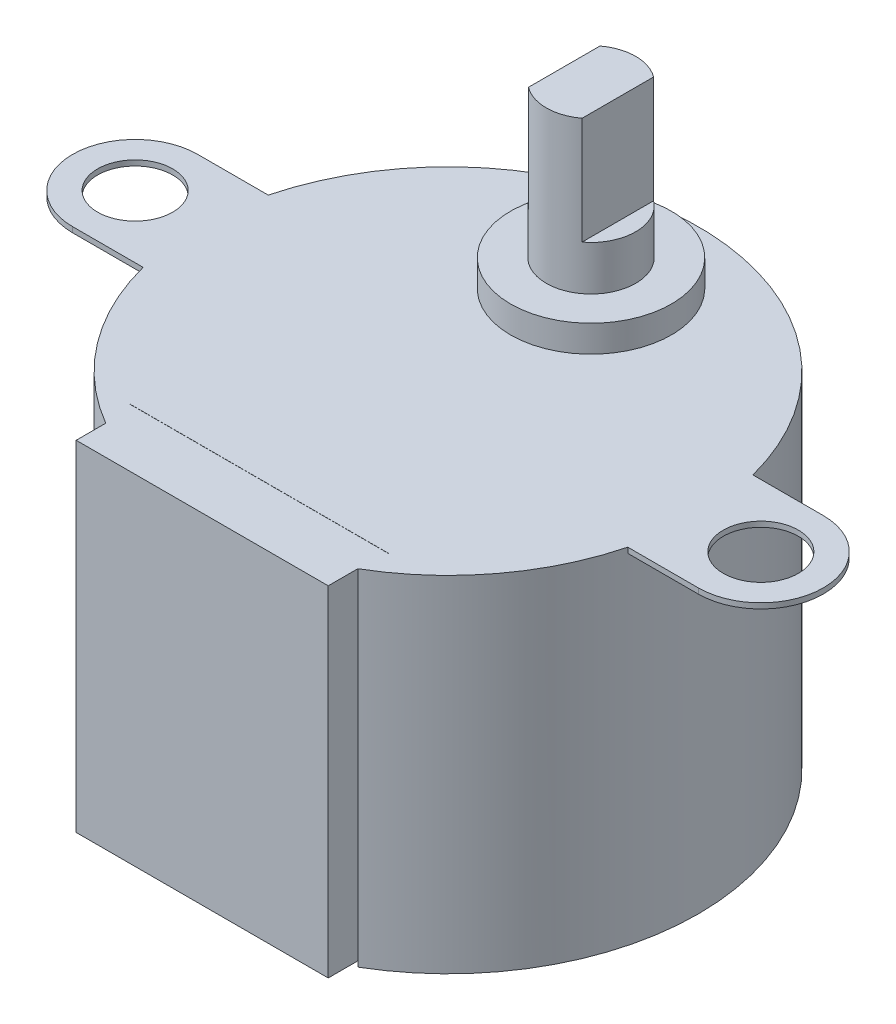
ISO-10303-21;
HEADER;
FILE_DESCRIPTION(('STEP AP214'),'2;1');
FILE_NAME('part.step','',(''),(''),'','','');
FILE_SCHEMA(('AUTOMOTIVE_DESIGN { 1 0 10303 214 1 1 1 1 }'));
ENDSEC;
DATA;
#1=APPLICATION_CONTEXT('core data for automotive mechanical design processes');
#2=APPLICATION_PROTOCOL_DEFINITION('international standard','automotive_design',2000,#1);
#3=PRODUCT_CONTEXT('',#1,'mechanical');
#4=PRODUCT('Part','Part','',(#3));
#5=PRODUCT_RELATED_PRODUCT_CATEGORY('part','',(#4));
#6=PRODUCT_DEFINITION_FORMATION('','',#4);
#7=PRODUCT_DEFINITION_CONTEXT('part definition',#1,'design');
#8=PRODUCT_DEFINITION('design','',#6,#7);
#9=PRODUCT_DEFINITION_SHAPE('','',#8);
#10=(LENGTH_UNIT() NAMED_UNIT(*) SI_UNIT(.MILLI.,.METRE.));
#11=(NAMED_UNIT(*) PLANE_ANGLE_UNIT() SI_UNIT($,.RADIAN.));
#12=(NAMED_UNIT(*) SI_UNIT($,.STERADIAN.) SOLID_ANGLE_UNIT());
#13=UNCERTAINTY_MEASURE_WITH_UNIT(LENGTH_MEASURE(1.E-05),#10,'distance_accuracy_value','');
#14=(GEOMETRIC_REPRESENTATION_CONTEXT(3) GLOBAL_UNCERTAINTY_ASSIGNED_CONTEXT((#13)) GLOBAL_UNIT_ASSIGNED_CONTEXT((#10,
#11,#12)) REPRESENTATION_CONTEXT('',''));
#15=CARTESIAN_POINT('',(0.,0.,0.));
#16=DIRECTION('',(0.,0.,1.));
#17=DIRECTION('',(1.,0.,0.));
#18=AXIS2_PLACEMENT_3D('',#15,#16,#17);
#19=CARTESIAN_POINT('',(0.,20.5,-8.));
#20=DIRECTION('',(0.,-1.,0.));
#21=DIRECTION('',(0.,0.,-1.));
#22=AXIS2_PLACEMENT_3D('',#19,#20,#21);
#23=CYLINDRICAL_SURFACE('',#22,4.5);
#24=CARTESIAN_POINT('',(0.,20.5,-8.));
#25=DIRECTION('',(0.,1.,0.));
#26=DIRECTION('',(0.,0.,1.));
#27=AXIS2_PLACEMENT_3D('',#24,#25,#26);
#28=CIRCLE('',#27,4.5);
#29=CARTESIAN_POINT('',(0.,20.5,-3.5));
#30=VERTEX_POINT('',#29);
#31=EDGE_CURVE('E13',#30,#30,#28,.T.);
#32=ORIENTED_EDGE('',*,*,#31,.F.);
#33=EDGE_LOOP('',(#32));
#34=FACE_BOUND('',#33,.T.);
#35=CARTESIAN_POINT('',(0.,19.,-8.));
#36=DIRECTION('',(0.,1.,0.));
#37=DIRECTION('',(0.,0.,1.));
#38=AXIS2_PLACEMENT_3D('',#35,#36,#37);
#39=CIRCLE('',#38,4.5);
#40=CARTESIAN_POINT('',(0.,19.,-3.5));
#41=VERTEX_POINT('',#40);
#42=EDGE_CURVE('E75',#41,#41,#39,.T.);
#43=ORIENTED_EDGE('',*,*,#42,.T.);
#44=EDGE_LOOP('',(#43));
#45=FACE_BOUND('',#44,.T.);
#46=ADVANCED_FACE('F72',(#34,#45),#23,.T.);
#47=CARTESIAN_POINT('',(0.,20.5,-8.));
#48=DIRECTION('',(0.,1.,0.));
#49=DIRECTION('',(0.,0.,1.));
#50=AXIS2_PLACEMENT_3D('',#47,#48,#49);
#51=PLANE('',#50);
#52=CARTESIAN_POINT('',(0.,20.5,-8.));
#53=DIRECTION('',(0.,1.,0.));
#54=DIRECTION('',(0.,0.,1.));
#55=AXIS2_PLACEMENT_3D('',#52,#53,#54);
#56=CIRCLE('',#55,2.5);
#57=CARTESIAN_POINT('',(0.,20.5,-5.5));
#58=VERTEX_POINT('',#57);
#59=EDGE_CURVE('E143',#58,#58,#56,.T.);
#60=ORIENTED_EDGE('',*,*,#59,.F.);
#61=EDGE_LOOP('',(#60));
#62=FACE_BOUND('',#61,.T.);
#63=ORIENTED_EDGE('',*,*,#31,.T.);
#64=EDGE_LOOP('',(#63));
#65=FACE_BOUND('',#64,.T.);
#66=ADVANCED_FACE('F166',(#62,#65),#51,.T.);
#67=CARTESIAN_POINT('',(0.,19.,-8.));
#68=DIRECTION('',(0.,1.,0.));
#69=DIRECTION('',(0.,0.,1.));
#70=AXIS2_PLACEMENT_3D('',#67,#68,#69);
#71=PLANE('',#70);
#72=ORIENTED_EDGE('',*,*,#42,.F.);
#73=EDGE_LOOP('',(#72));
#74=FACE_BOUND('',#73,.T.);
#75=ADVANCED_FACE('F171',(#74),#71,.F.);
#76=CARTESIAN_POINT('',(0.,29.,-8.));
#77=DIRECTION('',(0.,-1.,0.));
#78=DIRECTION('',(0.,0.,-1.));
#79=AXIS2_PLACEMENT_3D('',#76,#77,#78);
#80=CYLINDRICAL_SURFACE('',#79,2.5);
#81=CARTESIAN_POINT('',(0.,29.,-8.));
#82=DIRECTION('',(0.,1.,0.));
#83=DIRECTION('',(0.,0.,1.));
#84=AXIS2_PLACEMENT_3D('',#81,#82,#83);
#85=CIRCLE('',#84,2.5);
#86=CARTESIAN_POINT('',(1.5,29.,-10.));
#87=VERTEX_POINT('',#86);
#88=CARTESIAN_POINT('',(-1.5,29.,-10.));
#89=VERTEX_POINT('',#88);
#90=EDGE_CURVE('E129',#87,#89,#85,.T.);
#91=ORIENTED_EDGE('',*,*,#90,.F.);
#92=DIRECTION('',(0.,1.,0.));
#93=VECTOR('',#92,1.);
#94=CARTESIAN_POINT('',(1.5,23.,-10.));
#95=LINE('',#94,#93);
#96=CARTESIAN_POINT('',(1.5,23.,-10.));
#97=VERTEX_POINT('',#96);
#98=EDGE_CURVE('E86',#97,#87,#95,.T.);
#99=ORIENTED_EDGE('',*,*,#98,.F.);
#100=CARTESIAN_POINT('',(0.,23.,-8.));
#101=DIRECTION('',(0.,1.,0.));
#102=DIRECTION('',(0.,0.,-1.));
#103=AXIS2_PLACEMENT_3D('',#100,#101,#102);
#104=CIRCLE('',#103,2.5);
#105=CARTESIAN_POINT('',(1.5,23.,-6.));
#106=VERTEX_POINT('',#105);
#107=EDGE_CURVE('E115',#106,#97,#104,.T.);
#108=ORIENTED_EDGE('',*,*,#107,.F.);
#109=DIRECTION('',(0.,1.,0.));
#110=VECTOR('',#109,1.);
#111=CARTESIAN_POINT('',(1.5,23.,-6.));
#112=LINE('',#111,#110);
#113=CARTESIAN_POINT('',(1.5,29.,-6.));
#114=VERTEX_POINT('',#113);
#115=EDGE_CURVE('E123',#106,#114,#112,.T.);
#116=ORIENTED_EDGE('',*,*,#115,.T.);
#117=CARTESIAN_POINT('',(-1.5,29.,-6.));
#118=VERTEX_POINT('',#117);
#119=EDGE_CURVE('E145',#118,#114,#85,.T.);
#120=ORIENTED_EDGE('',*,*,#119,.F.);
#121=DIRECTION('',(0.,1.,0.));
#122=VECTOR('',#121,1.);
#123=CARTESIAN_POINT('',(-1.5,23.,-6.));
#124=LINE('',#123,#122);
#125=CARTESIAN_POINT('',(-1.5,23.,-6.));
#126=VERTEX_POINT('',#125);
#127=EDGE_CURVE('E94',#126,#118,#124,.T.);
#128=ORIENTED_EDGE('',*,*,#127,.F.);
#129=CARTESIAN_POINT('',(0.,23.,-8.));
#130=DIRECTION('',(0.,1.,0.));
#131=DIRECTION('',(0.,0.,1.));
#132=AXIS2_PLACEMENT_3D('',#129,#130,#131);
#133=CIRCLE('',#132,2.5);
#134=CARTESIAN_POINT('',(-1.5,23.,-10.));
#135=VERTEX_POINT('',#134);
#136=EDGE_CURVE('E135',#135,#126,#133,.T.);
#137=ORIENTED_EDGE('',*,*,#136,.F.);
#138=DIRECTION('',(0.,1.,0.));
#139=VECTOR('',#138,1.);
#140=CARTESIAN_POINT('',(-1.5,23.,-10.));
#141=LINE('',#140,#139);
#142=EDGE_CURVE('E141',#135,#89,#141,.T.);
#143=ORIENTED_EDGE('',*,*,#142,.T.);
#144=EDGE_LOOP('',(#91,#99,#108,#116,#120,#128,#137,#143));
#145=FACE_BOUND('',#144,.T.);
#146=ORIENTED_EDGE('',*,*,#59,.T.);
#147=EDGE_LOOP('',(#146));
#148=FACE_BOUND('',#147,.T.);
#149=ADVANCED_FACE('F126',(#145,#148),#80,.T.);
#150=CARTESIAN_POINT('',(0.,29.,-8.));
#151=DIRECTION('',(0.,1.,0.));
#152=DIRECTION('',(0.,0.,1.));
#153=AXIS2_PLACEMENT_3D('',#150,#151,#152);
#154=PLANE('',#153);
#155=DIRECTION('',(0.,0.,1.));
#156=VECTOR('',#155,1.);
#157=CARTESIAN_POINT('',(1.5,29.,-10.));
#158=LINE('',#157,#156);
#159=EDGE_CURVE('E120',#87,#114,#158,.T.);
#160=ORIENTED_EDGE('',*,*,#159,.F.);
#161=ORIENTED_EDGE('',*,*,#90,.T.);
#162=DIRECTION('',(0.,0.,-1.));
#163=VECTOR('',#162,1.);
#164=CARTESIAN_POINT('',(-1.5,29.,-10.));
#165=LINE('',#164,#163);
#166=EDGE_CURVE('E131',#118,#89,#165,.T.);
#167=ORIENTED_EDGE('',*,*,#166,.F.);
#168=ORIENTED_EDGE('',*,*,#119,.T.);
#169=EDGE_LOOP('',(#160,#161,#167,#168));
#170=FACE_BOUND('',#169,.T.);
#171=ADVANCED_FACE('F151',(#170),#154,.T.);
#172=CARTESIAN_POINT('',(-1.5,23.,-10.));
#173=DIRECTION('',(1.,0.,0.));
#174=DIRECTION('',(0.,0.,-1.));
#175=AXIS2_PLACEMENT_3D('',#172,#173,#174);
#176=PLANE('',#175);
#177=ORIENTED_EDGE('',*,*,#166,.T.);
#178=ORIENTED_EDGE('',*,*,#142,.F.);
#179=DIRECTION('',(0.,0.,-1.));
#180=VECTOR('',#179,1.);
#181=CARTESIAN_POINT('',(-1.5,23.,-10.));
#182=LINE('',#181,#180);
#183=EDGE_CURVE('E137',#126,#135,#182,.T.);
#184=ORIENTED_EDGE('',*,*,#183,.F.);
#185=ORIENTED_EDGE('',*,*,#127,.T.);
#186=EDGE_LOOP('',(#177,#178,#184,#185));
#187=FACE_BOUND('',#186,.T.);
#188=ADVANCED_FACE('F153',(#187),#176,.F.);
#189=CARTESIAN_POINT('',(0.,23.,-8.));
#190=DIRECTION('',(0.,1.,0.));
#191=DIRECTION('',(0.,0.,1.));
#192=AXIS2_PLACEMENT_3D('',#189,#190,#191);
#193=PLANE('',#192);
#194=ORIENTED_EDGE('',*,*,#136,.T.);
#195=ORIENTED_EDGE('',*,*,#183,.T.);
#196=EDGE_LOOP('',(#194,#195));
#197=FACE_BOUND('',#196,.T.);
#198=ADVANCED_FACE('F156',(#197),#193,.T.);
#199=CARTESIAN_POINT('',(1.5,23.,-10.));
#200=DIRECTION('',(-1.,0.,0.));
#201=DIRECTION('',(0.,0.,1.));
#202=AXIS2_PLACEMENT_3D('',#199,#200,#201);
#203=PLANE('',#202);
#204=ORIENTED_EDGE('',*,*,#159,.T.);
#205=ORIENTED_EDGE('',*,*,#115,.F.);
#206=DIRECTION('',(0.,0.,1.));
#207=VECTOR('',#206,1.);
#208=CARTESIAN_POINT('',(1.5,23.,-10.));
#209=LINE('',#208,#207);
#210=EDGE_CURVE('E117',#97,#106,#209,.T.);
#211=ORIENTED_EDGE('',*,*,#210,.F.);
#212=ORIENTED_EDGE('',*,*,#98,.T.);
#213=EDGE_LOOP('',(#204,#205,#211,#212));
#214=FACE_BOUND('',#213,.T.);
#215=ADVANCED_FACE('F122',(#214),#203,.F.);
#216=CARTESIAN_POINT('',(0.,23.,-8.));
#217=DIRECTION('',(0.,-1.,0.));
#218=DIRECTION('',(0.,0.,-1.));
#219=AXIS2_PLACEMENT_3D('',#216,#217,#218);
#220=PLANE('',#219);
#221=ORIENTED_EDGE('',*,*,#107,.T.);
#222=ORIENTED_EDGE('',*,*,#210,.T.);
#223=EDGE_LOOP('',(#221,#222));
#224=FACE_BOUND('',#223,.T.);
#225=ADVANCED_FACE('F116',(#224),#220,.F.);
#226=CLOSED_SHELL('',(#46,#66,#75,#149,#171,#188,#198,#215,#225));
#227=MANIFOLD_SOLID_BREP('B2',#226);
#228=CARTESIAN_POINT('',(0.,0.,0.));
#229=DIRECTION('',(0.,1.,0.));
#230=DIRECTION('',(0.,0.,1.));
#231=AXIS2_PLACEMENT_3D('',#228,#229,#230);
#232=PLANE('',#231);
#233=DIRECTION('',(0.,0.,-1.));
#234=VECTOR('',#233,1.);
#235=CARTESIAN_POINT('',(7.06267964530488,0.,10.7438975791592));
#236=LINE('',#235,#234);
#237=CARTESIAN_POINT('',(7.06267964530488,0.,12.0879508696799));
#238=VERTEX_POINT('',#237);
#239=CARTESIAN_POINT('',(7.05633982265244,0.,10.7469487895796));
#240=VERTEX_POINT('',#239);
#241=EDGE_CURVE('E263',#238,#240,#236,.T.);
#242=ORIENTED_EDGE('',*,*,#241,.F.);
#243=CARTESIAN_POINT('',(0.,0.,0.));
#244=DIRECTION('',(0.,1.,0.));
#245=DIRECTION('',(0.,0.,1.));
#246=AXIS2_PLACEMENT_3D('',#243,#244,#245);
#247=CIRCLE('',#246,14.);
#248=CARTESIAN_POINT('',(7.05,0.,12.0953503463108));
#249=VERTEX_POINT('',#248);
#250=EDGE_CURVE('E596',#249,#238,#247,.T.);
#251=ORIENTED_EDGE('',*,*,#250,.F.);
#252=DIRECTION('',(0.,0.,-1.));
#253=VECTOR('',#252,1.);
#254=CARTESIAN_POINT('',(7.05,0.,13.75));
#255=LINE('',#254,#253);
#256=CARTESIAN_POINT('',(7.05,0.,13.75));
#257=VERTEX_POINT('',#256);
#258=EDGE_CURVE('E431',#257,#249,#255,.T.);
#259=ORIENTED_EDGE('',*,*,#258,.F.);
#260=DIRECTION('',(1.,0.,0.));
#261=VECTOR('',#260,1.);
#262=CARTESIAN_POINT('',(-7.05,0.,13.75));
#263=LINE('',#262,#261);
#264=CARTESIAN_POINT('',(-7.05,0.,13.75));
#265=VERTEX_POINT('',#264);
#266=EDGE_CURVE('E417',#265,#257,#263,.T.);
#267=ORIENTED_EDGE('',*,*,#266,.F.);
#268=DIRECTION('',(0.,0.,-1.));
#269=VECTOR('',#268,1.);
#270=CARTESIAN_POINT('',(-7.05,0.,13.75));
#271=LINE('',#270,#269);
#272=CARTESIAN_POINT('',(-7.04987773098629,0.,12.0954849220939));
#273=VERTEX_POINT('',#272);
#274=EDGE_CURVE('E434',#265,#273,#271,.T.);
#275=ORIENTED_EDGE('',*,*,#274,.T.);
#276=DIRECTION('',(0.,0.,-1.));
#277=VECTOR('',#276,1.);
#278=CARTESIAN_POINT('',(-7.04932093730459,0.,0.));
#279=LINE('',#278,#277);
#280=CARTESIAN_POINT('',(-7.04932093730459,0.,10.7438975791592));
#281=VERTEX_POINT('',#280);
#282=EDGE_CURVE('E598',#273,#281,#279,.T.);
#283=ORIENTED_EDGE('',*,*,#282,.T.);
#284=DIRECTION('',(1.,0.,0.));
#285=VECTOR('',#284,1.);
#286=CARTESIAN_POINT('',(0.,0.,10.7438975791592));
#287=LINE('',#286,#285);
#288=EDGE_CURVE('E580',#281,#240,#287,.T.);
#289=ORIENTED_EDGE('',*,*,#288,.T.);
#290=EDGE_LOOP('',(#242,#251,#259,#267,#275,#283,#289));
#291=FACE_BOUND('',#290,.T.);
#292=ADVANCED_FACE('F245',(#291),#232,.F.);
#293=CARTESIAN_POINT('',(7.30000000000001,19.,11.3560556532627));
#294=DIRECTION('',(-1.,0.,0.));
#295=DIRECTION('',(0.,0.,1.));
#296=AXIS2_PLACEMENT_3D('',#293,#294,#295);
#297=PLANE('',#296);
#298=DIRECTION('',(0.,0.,-1.));
#299=VECTOR('',#298,1.);
#300=CARTESIAN_POINT('',(7.30000000000001,18.7,11.3560556532627));
#301=LINE('',#300,#299);
#302=CARTESIAN_POINT('',(7.30000000000001,18.7,11.3560556532627));
#303=VERTEX_POINT('',#302);
#304=CARTESIAN_POINT('',(7.30000000000001,18.7,10.5));
#305=VERTEX_POINT('',#304);
#306=EDGE_CURVE('E545',#303,#305,#301,.T.);
#307=ORIENTED_EDGE('',*,*,#306,.F.);
#308=DIRECTION('',(0.,-1.,0.));
#309=VECTOR('',#308,1.);
#310=CARTESIAN_POINT('',(7.30000000000001,19.,11.3560556532627));
#311=LINE('',#310,#309);
#312=CARTESIAN_POINT('',(7.30000000000001,0.,11.3560556532627));
#313=VERTEX_POINT('',#312);
#314=EDGE_CURVE('E578',#303,#313,#311,.T.);
#315=ORIENTED_EDGE('',*,*,#314,.T.);
#316=DIRECTION('',(0.,0.,-1.));
#317=VECTOR('',#316,1.);
#318=CARTESIAN_POINT('',(7.30000000000001,0.,11.3560556532627));
#319=LINE('',#318,#317);
#320=CARTESIAN_POINT('',(7.30000000000001,0.,10.5));
#321=VERTEX_POINT('',#320);
#322=EDGE_CURVE('E563',#313,#321,#319,.T.);
#323=ORIENTED_EDGE('',*,*,#322,.T.);
#324=DIRECTION('',(0.,-1.,0.));
#325=VECTOR('',#324,1.);
#326=CARTESIAN_POINT('',(7.30000000000001,19.,10.5));
#327=LINE('',#326,#325);
#328=EDGE_CURVE('E566',#305,#321,#327,.T.);
#329=ORIENTED_EDGE('',*,*,#328,.F.);
#330=EDGE_LOOP('',(#307,#315,#323,#329));
#331=FACE_BOUND('',#330,.T.);
#332=ADVANCED_FACE('F665',(#331),#297,.F.);
#333=CARTESIAN_POINT('',(0.,19.,0.));
#334=DIRECTION('',(0.,-1.,0.));
#335=DIRECTION('',(0.,0.,-1.));
#336=AXIS2_PLACEMENT_3D('',#333,#334,#335);
#337=CYLINDRICAL_SURFACE('',#336,13.5);
#338=ORIENTED_EDGE('',*,*,#314,.F.);
#339=CARTESIAN_POINT('',(0.,18.7,0.));
#340=DIRECTION('',(0.,1.,0.));
#341=DIRECTION('',(0.,0.,1.));
#342=AXIS2_PLACEMENT_3D('',#339,#340,#341);
#343=CIRCLE('',#342,13.5);
#344=CARTESIAN_POINT('',(-7.29999999999999,18.7,11.3560556532627));
#345=VERTEX_POINT('',#344);
#346=EDGE_CURVE('E593',#303,#345,#343,.T.);
#347=ORIENTED_EDGE('',*,*,#346,.T.);
#348=DIRECTION('',(0.,-1.,0.));
#349=VECTOR('',#348,1.);
#350=CARTESIAN_POINT('',(-7.29999999999999,19.,11.3560556532627));
#351=LINE('',#350,#349);
#352=CARTESIAN_POINT('',(-7.29999999999999,0.,11.3560556532627));
#353=VERTEX_POINT('',#352);
#354=EDGE_CURVE('E581',#345,#353,#351,.T.);
#355=ORIENTED_EDGE('',*,*,#354,.T.);
#356=CARTESIAN_POINT('',(0.,0.,0.));
#357=DIRECTION('',(0.,1.,0.));
#358=DIRECTION('',(0.,0.,1.));
#359=AXIS2_PLACEMENT_3D('',#356,#357,#358);
#360=CIRCLE('',#359,13.5);
#361=EDGE_CURVE('E567',#313,#353,#360,.T.);
#362=ORIENTED_EDGE('',*,*,#361,.F.);
#363=EDGE_LOOP('',(#338,#347,#355,#362));
#364=FACE_BOUND('',#363,.T.);
#365=ADVANCED_FACE('F669',(#364),#337,.F.);
#366=CARTESIAN_POINT('',(-7.29999999999999,19.,11.3560556532627));
#367=DIRECTION('',(-1.,0.,0.));
#368=DIRECTION('',(0.,0.,1.));
#369=AXIS2_PLACEMENT_3D('',#366,#367,#368);
#370=PLANE('',#369);
#371=ORIENTED_EDGE('',*,*,#354,.F.);
#372=DIRECTION('',(0.,0.,-1.));
#373=VECTOR('',#372,1.);
#374=CARTESIAN_POINT('',(-7.29999999999999,18.7,11.3560556532627));
#375=LINE('',#374,#373);
#376=CARTESIAN_POINT('',(-7.29999999999999,18.7,10.5));
#377=VERTEX_POINT('',#376);
#378=EDGE_CURVE('E549',#345,#377,#375,.T.);
#379=ORIENTED_EDGE('',*,*,#378,.T.);
#380=DIRECTION('',(0.,-1.,0.));
#381=VECTOR('',#380,1.);
#382=CARTESIAN_POINT('',(-7.29999999999999,19.,10.5));
#383=LINE('',#382,#381);
#384=CARTESIAN_POINT('',(-7.29999999999999,0.,10.5));
#385=VERTEX_POINT('',#384);
#386=EDGE_CURVE('E583',#377,#385,#383,.T.);
#387=ORIENTED_EDGE('',*,*,#386,.T.);
#388=DIRECTION('',(0.,0.,-1.));
#389=VECTOR('',#388,1.);
#390=CARTESIAN_POINT('',(-7.29999999999999,0.,11.3560556532627));
#391=LINE('',#390,#389);
#392=EDGE_CURVE('E573',#353,#385,#391,.T.);
#393=ORIENTED_EDGE('',*,*,#392,.F.);
#394=EDGE_LOOP('',(#371,#379,#387,#393));
#395=FACE_BOUND('',#394,.T.);
#396=ADVANCED_FACE('F676',(#395),#370,.T.);
#397=CARTESIAN_POINT('',(-7.29999999999999,19.,10.5));
#398=DIRECTION('',(0.,0.,-1.));
#399=DIRECTION('',(-1.,0.,0.));
#400=AXIS2_PLACEMENT_3D('',#397,#398,#399);
#401=PLANE('',#400);
#402=ORIENTED_EDGE('',*,*,#386,.F.);
#403=DIRECTION('',(1.,0.,0.));
#404=VECTOR('',#403,1.);
#405=CARTESIAN_POINT('',(-7.29999999999999,18.7,10.5));
#406=LINE('',#405,#404);
#407=CARTESIAN_POINT('',(-7.28718717807519,18.7,10.5));
#408=VERTEX_POINT('',#407);
#409=EDGE_CURVE('E546',#377,#408,#406,.T.);
#410=ORIENTED_EDGE('',*,*,#409,.T.);
#411=DIRECTION('',(0.,1.,0.));
#412=VECTOR('',#411,1.);
#413=CARTESIAN_POINT('',(-7.28718717807519,19.,10.5));
#414=LINE('',#413,#412);
#415=CARTESIAN_POINT('',(-7.28718717807519,19.,10.5));
#416=VERTEX_POINT('',#415);
#417=EDGE_CURVE('E70',#408,#416,#414,.T.);
#418=ORIENTED_EDGE('',*,*,#417,.T.);
#419=DIRECTION('',(1.,0.,0.));
#420=VECTOR('',#419,1.);
#421=CARTESIAN_POINT('',(-7.29999999999999,19.,10.5));
#422=LINE('',#421,#420);
#423=CARTESIAN_POINT('',(7.27935857118831,19.,10.5));
#424=VERTEX_POINT('',#423);
#425=EDGE_CURVE('E564',#416,#424,#422,.T.);
#426=ORIENTED_EDGE('',*,*,#425,.T.);
#427=DIRECTION('',(0.,-1.,0.));
#428=VECTOR('',#427,1.);
#429=CARTESIAN_POINT('',(7.27935857118831,19.,10.5));
#430=LINE('',#429,#428);
#431=CARTESIAN_POINT('',(7.27935857118831,18.7,10.5));
#432=VERTEX_POINT('',#431);
#433=EDGE_CURVE('E255',#424,#432,#430,.T.);
#434=ORIENTED_EDGE('',*,*,#433,.T.);
#435=EDGE_CURVE('E543',#432,#305,#406,.T.);
#436=ORIENTED_EDGE('',*,*,#435,.T.);
#437=ORIENTED_EDGE('',*,*,#328,.T.);
#438=DIRECTION('',(1.,0.,0.));
#439=VECTOR('',#438,1.);
#440=CARTESIAN_POINT('',(-7.29999999999999,0.,10.5));
#441=LINE('',#440,#439);
#442=EDGE_CURVE('E570',#385,#321,#441,.T.);
#443=ORIENTED_EDGE('',*,*,#442,.F.);
#444=EDGE_LOOP('',(#402,#410,#418,#426,#434,#436,#437,#443));
#445=FACE_BOUND('',#444,.T.);
#446=ADVANCED_FACE('F673',(#445),#401,.T.);
#447=CARTESIAN_POINT('',(0.,19.,0.));
#448=DIRECTION('',(0.,-1.,0.));
#449=DIRECTION('',(0.,0.,-1.));
#450=AXIS2_PLACEMENT_3D('',#447,#448,#449);
#451=CYLINDRICAL_SURFACE('',#450,14.);
#452=CARTESIAN_POINT('',(0.,18.7,0.));
#453=DIRECTION('',(0.,1.,0.));
#454=DIRECTION('',(0.,0.,1.));
#455=AXIS2_PLACEMENT_3D('',#452,#453,#454);
#456=CIRCLE('',#455,14.);
#457=CARTESIAN_POINT('',(13.555441711726,18.7,3.5));
#458=VERTEX_POINT('',#457);
#459=CARTESIAN_POINT('',(13.555441711726,18.7,-3.5));
#460=VERTEX_POINT('',#459);
#461=EDGE_CURVE('E554',#458,#460,#456,.T.);
#462=ORIENTED_EDGE('',*,*,#461,.F.);
#463=DIRECTION('',(0.,-1.,0.));
#464=VECTOR('',#463,1.);
#465=CARTESIAN_POINT('',(13.555441711726,19.,3.5));
#466=LINE('',#465,#464);
#467=CARTESIAN_POINT('',(13.555441711726,19.,3.5));
#468=VERTEX_POINT('',#467);
#469=EDGE_CURVE('E559',#458,#468,#466,.F.);
#470=ORIENTED_EDGE('',*,*,#469,.T.);
#471=CARTESIAN_POINT('',(0.,19.,0.));
#472=DIRECTION('',(0.,1.,0.));
#473=DIRECTION('',(0.,0.,1.));
#474=AXIS2_PLACEMENT_3D('',#471,#472,#473);
#475=CIRCLE('',#474,14.);
#476=CARTESIAN_POINT('',(7.05,19.,12.0953503463108));
#477=VERTEX_POINT('',#476);
#478=EDGE_CURVE('E587',#477,#468,#475,.T.);
#479=ORIENTED_EDGE('',*,*,#478,.F.);
#480=DIRECTION('',(0.,-1.,0.));
#481=VECTOR('',#480,1.);
#482=CARTESIAN_POINT('',(7.05,19.,12.0953503463108));
#483=LINE('',#482,#481);
#484=EDGE_CURVE('E425',#477,#249,#483,.T.);
#485=ORIENTED_EDGE('',*,*,#484,.T.);
#486=ORIENTED_EDGE('',*,*,#250,.T.);
#487=DIRECTION('',(0.,1.,0.));
#488=VECTOR('',#487,1.);
#489=CARTESIAN_POINT('',(7.06267964530488,-0.3,12.0879508696799));
#490=LINE('',#489,#488);
#491=CARTESIAN_POINT('',(7.06267964530488,-0.3,12.0879508696799));
#492=VERTEX_POINT('',#491);
#493=EDGE_CURVE('E454',#492,#238,#490,.T.);
#494=ORIENTED_EDGE('',*,*,#493,.F.);
#495=CARTESIAN_POINT('',(0.,-0.3,0.));
#496=DIRECTION('',(0.,-1.,0.));
#497=DIRECTION('',(0.,0.,-1.));
#498=AXIS2_PLACEMENT_3D('',#495,#496,#497);
#499=CIRCLE('',#498,14.);
#500=CARTESIAN_POINT('',(-7.04932093730459,-0.3,12.0957461251003));
#501=VERTEX_POINT('',#500);
#502=EDGE_CURVE('E441',#501,#492,#499,.T.);
#503=ORIENTED_EDGE('',*,*,#502,.F.);
#504=DIRECTION('',(0.,1.,0.));
#505=VECTOR('',#504,1.);
#506=CARTESIAN_POINT('',(-7.04932093730459,-0.3,12.0957461251003));
#507=LINE('',#506,#505);
#508=EDGE_CURVE('E459',#501,#273,#507,.T.);
#509=ORIENTED_EDGE('',*,*,#508,.T.);
#510=DIRECTION('',(0.,-1.,0.));
#511=VECTOR('',#510,1.);
#512=CARTESIAN_POINT('',(-7.05,19.,12.0953503463108));
#513=LINE('',#512,#511);
#514=CARTESIAN_POINT('',(-7.05,19.,12.0953503463108));
#515=VERTEX_POINT('',#514);
#516=EDGE_CURVE('E589',#515,#273,#513,.T.);
#517=ORIENTED_EDGE('',*,*,#516,.F.);
#518=CARTESIAN_POINT('',(-13.555441711726,19.,3.5));
#519=VERTEX_POINT('',#518);
#520=EDGE_CURVE('E591',#519,#515,#475,.T.);
#521=ORIENTED_EDGE('',*,*,#520,.F.);
#522=DIRECTION('',(0.,-1.,0.));
#523=VECTOR('',#522,1.);
#524=CARTESIAN_POINT('',(-13.555441711726,19.,3.5));
#525=LINE('',#524,#523);
#526=CARTESIAN_POINT('',(-13.555441711726,18.7,3.5));
#527=VERTEX_POINT('',#526);
#528=EDGE_CURVE('E561',#519,#527,#525,.T.);
#529=ORIENTED_EDGE('',*,*,#528,.T.);
#530=CARTESIAN_POINT('',(-13.555441711726,18.7,-3.5));
#531=VERTEX_POINT('',#530);
#532=EDGE_CURVE('E551',#531,#527,#456,.T.);
#533=ORIENTED_EDGE('',*,*,#532,.F.);
#534=DIRECTION('',(0.,-1.,0.));
#535=VECTOR('',#534,1.);
#536=CARTESIAN_POINT('',(-13.555441711726,19.,-3.5));
#537=LINE('',#536,#535);
#538=CARTESIAN_POINT('',(-13.555441711726,19.,-3.5));
#539=VERTEX_POINT('',#538);
#540=EDGE_CURVE('E555',#531,#539,#537,.F.);
#541=ORIENTED_EDGE('',*,*,#540,.T.);
#542=CARTESIAN_POINT('',(13.555441711726,19.,-3.5));
#543=VERTEX_POINT('',#542);
#544=EDGE_CURVE('E590',#543,#539,#475,.T.);
#545=ORIENTED_EDGE('',*,*,#544,.F.);
#546=DIRECTION('',(0.,-1.,0.));
#547=VECTOR('',#546,1.);
#548=CARTESIAN_POINT('',(13.555441711726,19.,-3.5));
#549=LINE('',#548,#547);
#550=EDGE_CURVE('E557',#543,#460,#549,.T.);
#551=ORIENTED_EDGE('',*,*,#550,.T.);
#552=EDGE_LOOP('',(#462,#470,#479,#485,#486,#494,#503,#509,#517,#521,#529,#533,#541,#545,#551));
#553=FACE_BOUND('',#552,.T.);
#554=ADVANCED_FACE('F247',(#553),#451,.T.);
#555=CARTESIAN_POINT('',(0.,19.,0.));
#556=DIRECTION('',(0.,1.,0.));
#557=DIRECTION('',(0.,0.,1.));
#558=AXIS2_PLACEMENT_3D('',#555,#556,#557);
#559=PLANE('',#558);
#560=DIRECTION('',(0.,0.,1.));
#561=VECTOR('',#560,1.);
#562=CARTESIAN_POINT('',(7.27935857118831,19.,11.3692980782486));
#563=LINE('',#562,#561);
#564=CARTESIAN_POINT('',(7.27935857118831,19.,10.4909931159559));
#565=VERTEX_POINT('',#564);
#566=EDGE_CURVE('E500',#565,#424,#563,.T.);
#567=ORIENTED_EDGE('',*,*,#566,.T.);
#568=ORIENTED_EDGE('',*,*,#425,.F.);
#569=DIRECTION('',(0.,0.,-1.));
#570=VECTOR('',#569,1.);
#571=CARTESIAN_POINT('',(-7.28718717807519,19.,11.3642818968775));
#572=LINE('',#571,#570);
#573=CARTESIAN_POINT('',(-7.28718717807519,19.,10.4909931159559));
#574=VERTEX_POINT('',#573);
#575=EDGE_CURVE('E496',#416,#574,#572,.T.);
#576=ORIENTED_EDGE('',*,*,#575,.T.);
#577=DIRECTION('',(1.,0.,0.));
#578=VECTOR('',#577,1.);
#579=CARTESIAN_POINT('',(-7.28718717807519,19.,10.4909931159559));
#580=LINE('',#579,#578);
#581=EDGE_CURVE('E498',#574,#565,#580,.T.);
#582=ORIENTED_EDGE('',*,*,#581,.T.);
#583=EDGE_LOOP('',(#567,#568,#576,#582));
#584=FACE_BOUND('',#583,.T.);
#585=ORIENTED_EDGE('',*,*,#544,.T.);
#586=DIRECTION('',(-1.,0.,0.));
#587=VECTOR('',#586,1.);
#588=CARTESIAN_POINT('',(-13.0384048104053,19.,-3.5));
#589=LINE('',#588,#587);
#590=CARTESIAN_POINT('',(-17.5,19.,-3.49999999999999));
#591=VERTEX_POINT('',#590);
#592=EDGE_CURVE('E489',#539,#591,#589,.T.);
#593=ORIENTED_EDGE('',*,*,#592,.T.);
#594=CARTESIAN_POINT('',(-17.5,19.,0.));
#595=DIRECTION('',(0.,1.,0.));
#596=DIRECTION('',(0.,0.,1.));
#597=AXIS2_PLACEMENT_3D('',#594,#595,#596);
#598=CIRCLE('',#597,3.5);
#599=CARTESIAN_POINT('',(-17.5,19.,3.5));
#600=VERTEX_POINT('',#599);
#601=EDGE_CURVE('E491',#591,#600,#598,.T.);
#602=ORIENTED_EDGE('',*,*,#601,.T.);
#603=DIRECTION('',(1.,0.,0.));
#604=VECTOR('',#603,1.);
#605=CARTESIAN_POINT('',(-13.0384048104053,19.,3.5));
#606=LINE('',#605,#604);
#607=EDGE_CURVE('E493',#600,#519,#606,.T.);
#608=ORIENTED_EDGE('',*,*,#607,.T.);
#609=ORIENTED_EDGE('',*,*,#520,.T.);
#610=DIRECTION('',(0.,0.,-1.));
#611=VECTOR('',#610,1.);
#612=CARTESIAN_POINT('',(-7.05,19.,13.75));
#613=LINE('',#612,#611);
#614=CARTESIAN_POINT('',(-7.05,19.,13.75));
#615=VERTEX_POINT('',#614);
#616=EDGE_CURVE('E410',#615,#515,#613,.T.);
#617=ORIENTED_EDGE('',*,*,#616,.F.);
#618=DIRECTION('',(1.,0.,0.));
#619=VECTOR('',#618,1.);
#620=CARTESIAN_POINT('',(-7.05,19.,13.75));
#621=LINE('',#620,#619);
#622=CARTESIAN_POINT('',(7.05,19.,13.75));
#623=VERTEX_POINT('',#622);
#624=EDGE_CURVE('E401',#615,#623,#621,.T.);
#625=ORIENTED_EDGE('',*,*,#624,.T.);
#626=DIRECTION('',(0.,0.,-1.));
#627=VECTOR('',#626,1.);
#628=CARTESIAN_POINT('',(7.05,19.,13.75));
#629=LINE('',#628,#627);
#630=EDGE_CURVE('E408',#623,#477,#629,.T.);
#631=ORIENTED_EDGE('',*,*,#630,.T.);
#632=ORIENTED_EDGE('',*,*,#478,.T.);
#633=DIRECTION('',(1.,0.,0.));
#634=VECTOR('',#633,1.);
#635=CARTESIAN_POINT('',(17.5,19.,3.49999999999999));
#636=LINE('',#635,#634);
#637=CARTESIAN_POINT('',(17.5,19.,3.49999999999999));
#638=VERTEX_POINT('',#637);
#639=EDGE_CURVE('E503',#468,#638,#636,.T.);
#640=ORIENTED_EDGE('',*,*,#639,.T.);
#641=CARTESIAN_POINT('',(17.5,19.,0.));
#642=DIRECTION('',(0.,1.,0.));
#643=DIRECTION('',(0.,0.,1.));
#644=AXIS2_PLACEMENT_3D('',#641,#642,#643);
#645=CIRCLE('',#644,3.5);
#646=CARTESIAN_POINT('',(17.5,19.,-3.50000000000001));
#647=VERTEX_POINT('',#646);
#648=EDGE_CURVE('E482',#638,#647,#645,.T.);
#649=ORIENTED_EDGE('',*,*,#648,.T.);
#650=DIRECTION('',(-1.,0.,0.));
#651=VECTOR('',#650,1.);
#652=CARTESIAN_POINT('',(17.5,19.,-3.50000000000001));
#653=LINE('',#652,#651);
#654=EDGE_CURVE('E485',#647,#543,#653,.T.);
#655=ORIENTED_EDGE('',*,*,#654,.T.);
#656=EDGE_LOOP('',(#585,#593,#602,#608,#609,#617,#625,#631,#632,#640,#649,#655));
#657=FACE_BOUND('',#656,.T.);
#658=CARTESIAN_POINT('',(0.,19.,-8.));
#659=DIRECTION('',(0.,1.,0.));
#660=DIRECTION('',(0.,0.,1.));
#661=AXIS2_PLACEMENT_3D('',#658,#659,#660);
#662=CIRCLE('',#661,4.5);
#663=CARTESIAN_POINT('',(0.,19.,-3.5));
#664=VERTEX_POINT('',#663);
#665=EDGE_CURVE('E464',#664,#664,#662,.T.);
#666=ORIENTED_EDGE('',*,*,#665,.F.);
#667=EDGE_LOOP('',(#666));
#668=FACE_BOUND('',#667,.T.);
#669=CARTESIAN_POINT('',(-17.5,19.,0.));
#670=DIRECTION('',(0.,1.,0.));
#671=DIRECTION('',(0.,0.,1.));
#672=AXIS2_PLACEMENT_3D('',#669,#670,#671);
#673=CIRCLE('',#672,2.1);
#674=CARTESIAN_POINT('',(-17.5,19.,2.10000000000001));
#675=VERTEX_POINT('',#674);
#676=EDGE_CURVE('E476',#675,#675,#673,.T.);
#677=ORIENTED_EDGE('',*,*,#676,.F.);
#678=EDGE_LOOP('',(#677));
#679=FACE_BOUND('',#678,.T.);
#680=CARTESIAN_POINT('',(17.5,19.,0.));
#681=DIRECTION('',(0.,1.,0.));
#682=DIRECTION('',(0.,0.,1.));
#683=AXIS2_PLACEMENT_3D('',#680,#681,#682);
#684=CIRCLE('',#683,2.1);
#685=CARTESIAN_POINT('',(17.5,19.,2.09999999999999));
#686=VERTEX_POINT('',#685);
#687=EDGE_CURVE('E470',#686,#686,#684,.T.);
#688=ORIENTED_EDGE('',*,*,#687,.F.);
#689=EDGE_LOOP('',(#688));
#690=FACE_BOUND('',#689,.T.);
#691=ADVANCED_FACE('F404',(#584,#657,#668,#679,#690),#559,.T.);
#692=CARTESIAN_POINT('',(-13.0384048104053,19.,-3.5));
#693=DIRECTION('',(0.,0.,1.));
#694=DIRECTION('',(1.,0.,0.));
#695=AXIS2_PLACEMENT_3D('',#692,#693,#694);
#696=PLANE('',#695);
#697=ORIENTED_EDGE('',*,*,#592,.F.);
#698=ORIENTED_EDGE('',*,*,#540,.F.);
#699=DIRECTION('',(-1.,0.,0.));
#700=VECTOR('',#699,1.);
#701=CARTESIAN_POINT('',(-13.0384048104053,18.7,-3.5));
#702=LINE('',#701,#700);
#703=CARTESIAN_POINT('',(-17.5,18.7,-3.49999999999999));
#704=VERTEX_POINT('',#703);
#705=EDGE_CURVE('E511',#531,#704,#702,.T.);
#706=ORIENTED_EDGE('',*,*,#705,.T.);
#707=DIRECTION('',(0.,-1.,0.));
#708=VECTOR('',#707,1.);
#709=CARTESIAN_POINT('',(-17.5,19.,-3.49999999999999));
#710=LINE('',#709,#708);
#711=EDGE_CURVE('E537',#591,#704,#710,.T.);
#712=ORIENTED_EDGE('',*,*,#711,.F.);
#713=EDGE_LOOP('',(#697,#698,#706,#712));
#714=FACE_BOUND('',#713,.T.);
#715=ADVANCED_FACE('F651',(#714),#696,.F.);
#716=CARTESIAN_POINT('',(-13.0384048104053,19.,3.5));
#717=DIRECTION('',(0.,0.,-1.));
#718=DIRECTION('',(-1.,0.,0.));
#719=AXIS2_PLACEMENT_3D('',#716,#717,#718);
#720=PLANE('',#719);
#721=DIRECTION('',(1.,0.,0.));
#722=VECTOR('',#721,1.);
#723=CARTESIAN_POINT('',(-13.0384048104053,18.7,3.5));
#724=LINE('',#723,#722);
#725=CARTESIAN_POINT('',(-17.5,18.7,3.5));
#726=VERTEX_POINT('',#725);
#727=EDGE_CURVE('E515',#726,#527,#724,.T.);
#728=ORIENTED_EDGE('',*,*,#727,.T.);
#729=ORIENTED_EDGE('',*,*,#528,.F.);
#730=ORIENTED_EDGE('',*,*,#607,.F.);
#731=DIRECTION('',(0.,-1.,0.));
#732=VECTOR('',#731,1.);
#733=CARTESIAN_POINT('',(-17.5,19.,3.5));
#734=LINE('',#733,#732);
#735=EDGE_CURVE('E534',#600,#726,#734,.T.);
#736=ORIENTED_EDGE('',*,*,#735,.T.);
#737=EDGE_LOOP('',(#728,#729,#730,#736));
#738=FACE_BOUND('',#737,.T.);
#739=ADVANCED_FACE('F637',(#738),#720,.F.);
#740=CARTESIAN_POINT('',(17.5,18.7,0.));
#741=DIRECTION('',(0.,1.,0.));
#742=DIRECTION('',(0.,0.,1.));
#743=AXIS2_PLACEMENT_3D('',#740,#741,#742);
#744=PLANE('',#743);
#745=CARTESIAN_POINT('',(17.5,18.7,0.));
#746=DIRECTION('',(0.,1.,0.));
#747=DIRECTION('',(0.,0.,1.));
#748=AXIS2_PLACEMENT_3D('',#745,#746,#747);
#749=CIRCLE('',#748,2.1);
#750=CARTESIAN_POINT('',(17.5,18.7,2.09999999999999));
#751=VERTEX_POINT('',#750);
#752=EDGE_CURVE('E467',#751,#751,#749,.T.);
#753=ORIENTED_EDGE('',*,*,#752,.T.);
#754=EDGE_LOOP('',(#753));
#755=FACE_BOUND('',#754,.T.);
#756=DIRECTION('',(1.,0.,0.));
#757=VECTOR('',#756,1.);
#758=CARTESIAN_POINT('',(17.5,18.7,3.49999999999999));
#759=LINE('',#758,#757);
#760=CARTESIAN_POINT('',(17.5,18.7,3.49999999999999));
#761=VERTEX_POINT('',#760);
#762=EDGE_CURVE('E486',#458,#761,#759,.T.);
#763=ORIENTED_EDGE('',*,*,#762,.F.);
#764=ORIENTED_EDGE('',*,*,#461,.T.);
#765=DIRECTION('',(-1.,0.,0.));
#766=VECTOR('',#765,1.);
#767=CARTESIAN_POINT('',(17.5,18.7,-3.50000000000001));
#768=LINE('',#767,#766);
#769=CARTESIAN_POINT('',(17.5,18.7,-3.50000000000001));
#770=VERTEX_POINT('',#769);
#771=EDGE_CURVE('E508',#770,#460,#768,.T.);
#772=ORIENTED_EDGE('',*,*,#771,.F.);
#773=CARTESIAN_POINT('',(17.5,18.7,0.));
#774=DIRECTION('',(0.,1.,0.));
#775=DIRECTION('',(0.,0.,1.));
#776=AXIS2_PLACEMENT_3D('',#773,#774,#775);
#777=CIRCLE('',#776,3.5);
#778=EDGE_CURVE('E479',#761,#770,#777,.T.);
#779=ORIENTED_EDGE('',*,*,#778,.F.);
#780=EDGE_LOOP('',(#763,#764,#772,#779));
#781=FACE_BOUND('',#780,.T.);
#782=ADVANCED_FACE('F658',(#755,#781),#744,.F.);
#783=CARTESIAN_POINT('',(-17.5,18.7,0.));
#784=DIRECTION('',(0.,1.,0.));
#785=DIRECTION('',(0.,0.,1.));
#786=AXIS2_PLACEMENT_3D('',#783,#784,#785);
#787=CIRCLE('',#786,2.1);
#788=CARTESIAN_POINT('',(-17.5,18.7,2.10000000000001));
#789=VERTEX_POINT('',#788);
#790=EDGE_CURVE('E473',#789,#789,#787,.T.);
#791=ORIENTED_EDGE('',*,*,#790,.T.);
#792=EDGE_LOOP('',(#791));
#793=FACE_BOUND('',#792,.T.);
#794=ORIENTED_EDGE('',*,*,#705,.F.);
#795=ORIENTED_EDGE('',*,*,#532,.T.);
#796=ORIENTED_EDGE('',*,*,#727,.F.);
#797=CARTESIAN_POINT('',(-17.5,18.7,0.));
#798=DIRECTION('',(0.,1.,0.));
#799=DIRECTION('',(0.,0.,1.));
#800=AXIS2_PLACEMENT_3D('',#797,#798,#799);
#801=CIRCLE('',#800,3.5);
#802=EDGE_CURVE('E513',#704,#726,#801,.T.);
#803=ORIENTED_EDGE('',*,*,#802,.F.);
#804=EDGE_LOOP('',(#794,#795,#796,#803));
#805=FACE_BOUND('',#804,.T.);
#806=ADVANCED_FACE('F648',(#793,#805),#744,.F.);
#807=ORIENTED_EDGE('',*,*,#346,.F.);
#808=ORIENTED_EDGE('',*,*,#306,.T.);
#809=ORIENTED_EDGE('',*,*,#435,.F.);
#810=DIRECTION('',(0.,0.,1.));
#811=VECTOR('',#810,1.);
#812=CARTESIAN_POINT('',(7.27935857118831,18.7,11.3692980782486));
#813=LINE('',#812,#811);
#814=CARTESIAN_POINT('',(7.27935857118831,18.7,10.4909931159559));
#815=VERTEX_POINT('',#814);
#816=EDGE_CURVE('E522',#815,#432,#813,.T.);
#817=ORIENTED_EDGE('',*,*,#816,.F.);
#818=DIRECTION('',(1.,0.,0.));
#819=VECTOR('',#818,1.);
#820=CARTESIAN_POINT('',(-7.28718717807519,18.7,10.4909931159559));
#821=LINE('',#820,#819);
#822=CARTESIAN_POINT('',(-7.28718717807519,18.7,10.4909931159559));
#823=VERTEX_POINT('',#822);
#824=EDGE_CURVE('E520',#823,#815,#821,.T.);
#825=ORIENTED_EDGE('',*,*,#824,.F.);
#826=DIRECTION('',(0.,0.,-1.));
#827=VECTOR('',#826,1.);
#828=CARTESIAN_POINT('',(-7.28718717807519,18.7,11.3642818968775));
#829=LINE('',#828,#827);
#830=EDGE_CURVE('E518',#408,#823,#829,.T.);
#831=ORIENTED_EDGE('',*,*,#830,.F.);
#832=ORIENTED_EDGE('',*,*,#409,.F.);
#833=ORIENTED_EDGE('',*,*,#378,.F.);
#834=EDGE_LOOP('',(#807,#808,#809,#817,#825,#831,#832,#833));
#835=FACE_BOUND('',#834,.T.);
#836=CARTESIAN_POINT('',(0.,18.7,-8.));
#837=DIRECTION('',(0.,1.,0.));
#838=DIRECTION('',(0.,0.,1.));
#839=AXIS2_PLACEMENT_3D('',#836,#837,#838);
#840=CIRCLE('',#839,4.5);
#841=CARTESIAN_POINT('',(0.,18.7,-3.5));
#842=VERTEX_POINT('',#841);
#843=EDGE_CURVE('E461',#842,#842,#840,.T.);
#844=ORIENTED_EDGE('',*,*,#843,.T.);
#845=EDGE_LOOP('',(#844));
#846=FACE_BOUND('',#845,.T.);
#847=ADVANCED_FACE('F690',(#835,#846),#744,.F.);
#848=CARTESIAN_POINT('',(17.5,19.,-3.50000000000001));
#849=DIRECTION('',(0.,0.,1.));
#850=DIRECTION('',(1.,0.,0.));
#851=AXIS2_PLACEMENT_3D('',#848,#849,#850);
#852=PLANE('',#851);
#853=ORIENTED_EDGE('',*,*,#771,.T.);
#854=ORIENTED_EDGE('',*,*,#550,.F.);
#855=ORIENTED_EDGE('',*,*,#654,.F.);
#856=DIRECTION('',(0.,-1.,0.));
#857=VECTOR('',#856,1.);
#858=CARTESIAN_POINT('',(17.5,19.,-3.50000000000001));
#859=LINE('',#858,#857);
#860=EDGE_CURVE('E540',#647,#770,#859,.T.);
#861=ORIENTED_EDGE('',*,*,#860,.T.);
#862=EDGE_LOOP('',(#853,#854,#855,#861));
#863=FACE_BOUND('',#862,.T.);
#864=ADVANCED_FACE('F688',(#863),#852,.F.);
#865=CARTESIAN_POINT('',(17.5,19.,3.49999999999999));
#866=DIRECTION('',(0.,0.,-1.));
#867=DIRECTION('',(-1.,0.,0.));
#868=AXIS2_PLACEMENT_3D('',#865,#866,#867);
#869=PLANE('',#868);
#870=ORIENTED_EDGE('',*,*,#639,.F.);
#871=ORIENTED_EDGE('',*,*,#469,.F.);
#872=ORIENTED_EDGE('',*,*,#762,.T.);
#873=DIRECTION('',(0.,-1.,0.));
#874=VECTOR('',#873,1.);
#875=CARTESIAN_POINT('',(17.5,19.,3.49999999999999));
#876=LINE('',#875,#874);
#877=EDGE_CURVE('E505',#638,#761,#876,.T.);
#878=ORIENTED_EDGE('',*,*,#877,.F.);
#879=EDGE_LOOP('',(#870,#871,#872,#878));
#880=FACE_BOUND('',#879,.T.);
#881=ADVANCED_FACE('F686',(#880),#869,.F.);
#882=CARTESIAN_POINT('',(17.5,19.,0.));
#883=DIRECTION('',(0.,-1.,0.));
#884=DIRECTION('',(0.,0.,-1.));
#885=AXIS2_PLACEMENT_3D('',#882,#883,#884);
#886=CYLINDRICAL_SURFACE('',#885,3.5);
#887=ORIENTED_EDGE('',*,*,#778,.T.);
#888=ORIENTED_EDGE('',*,*,#860,.F.);
#889=ORIENTED_EDGE('',*,*,#648,.F.);
#890=ORIENTED_EDGE('',*,*,#877,.T.);
#891=EDGE_LOOP('',(#887,#888,#889,#890));
#892=FACE_BOUND('',#891,.T.);
#893=ADVANCED_FACE('F684',(#892),#886,.T.);
#894=CARTESIAN_POINT('',(-17.5,19.,0.));
#895=DIRECTION('',(0.,-1.,0.));
#896=DIRECTION('',(0.,0.,-1.));
#897=AXIS2_PLACEMENT_3D('',#894,#895,#896);
#898=CYLINDRICAL_SURFACE('',#897,3.5);
#899=ORIENTED_EDGE('',*,*,#802,.T.);
#900=ORIENTED_EDGE('',*,*,#735,.F.);
#901=ORIENTED_EDGE('',*,*,#601,.F.);
#902=ORIENTED_EDGE('',*,*,#711,.T.);
#903=EDGE_LOOP('',(#899,#900,#901,#902));
#904=FACE_BOUND('',#903,.T.);
#905=ADVANCED_FACE('F644',(#904),#898,.T.);
#906=CARTESIAN_POINT('',(-7.28718717807519,19.,11.3642818968775));
#907=DIRECTION('',(-1.,0.,0.));
#908=DIRECTION('',(0.,0.,1.));
#909=AXIS2_PLACEMENT_3D('',#906,#907,#908);
#910=PLANE('',#909);
#911=ORIENTED_EDGE('',*,*,#417,.F.);
#912=ORIENTED_EDGE('',*,*,#830,.T.);
#913=DIRECTION('',(0.,-1.,0.));
#914=VECTOR('',#913,1.);
#915=CARTESIAN_POINT('',(-7.28718717807519,19.,10.4909931159559));
#916=LINE('',#915,#914);
#917=EDGE_CURVE('E531',#574,#823,#916,.T.);
#918=ORIENTED_EDGE('',*,*,#917,.F.);
#919=ORIENTED_EDGE('',*,*,#575,.F.);
#920=EDGE_LOOP('',(#911,#912,#918,#919));
#921=FACE_BOUND('',#920,.T.);
#922=ADVANCED_FACE('F727',(#921),#910,.F.);
#923=CARTESIAN_POINT('',(-7.28718717807519,19.,10.4909931159559));
#924=DIRECTION('',(0.,0.,-1.));
#925=DIRECTION('',(-1.,0.,0.));
#926=AXIS2_PLACEMENT_3D('',#923,#924,#925);
#927=PLANE('',#926);
#928=ORIENTED_EDGE('',*,*,#824,.T.);
#929=DIRECTION('',(0.,-1.,0.));
#930=VECTOR('',#929,1.);
#931=CARTESIAN_POINT('',(7.27935857118831,19.,10.4909931159559));
#932=LINE('',#931,#930);
#933=EDGE_CURVE('E528',#565,#815,#932,.T.);
#934=ORIENTED_EDGE('',*,*,#933,.F.);
#935=ORIENTED_EDGE('',*,*,#581,.F.);
#936=ORIENTED_EDGE('',*,*,#917,.T.);
#937=EDGE_LOOP('',(#928,#934,#935,#936));
#938=FACE_BOUND('',#937,.T.);
#939=ADVANCED_FACE('F723',(#938),#927,.F.);
#940=CARTESIAN_POINT('',(7.27935857118831,19.,11.3692980782486));
#941=DIRECTION('',(1.,0.,0.));
#942=DIRECTION('',(0.,0.,-1.));
#943=AXIS2_PLACEMENT_3D('',#940,#941,#942);
#944=PLANE('',#943);
#945=ORIENTED_EDGE('',*,*,#433,.F.);
#946=ORIENTED_EDGE('',*,*,#566,.F.);
#947=ORIENTED_EDGE('',*,*,#933,.T.);
#948=ORIENTED_EDGE('',*,*,#816,.T.);
#949=EDGE_LOOP('',(#945,#946,#947,#948));
#950=FACE_BOUND('',#949,.T.);
#951=ADVANCED_FACE('F720',(#950),#944,.F.);
#952=CARTESIAN_POINT('',(-17.5,19.,0.));
#953=DIRECTION('',(0.,-1.,0.));
#954=DIRECTION('',(0.,0.,-1.));
#955=AXIS2_PLACEMENT_3D('',#952,#953,#954);
#956=CYLINDRICAL_SURFACE('',#955,2.1);
#957=ORIENTED_EDGE('',*,*,#676,.T.);
#958=EDGE_LOOP('',(#957));
#959=FACE_BOUND('',#958,.T.);
#960=ORIENTED_EDGE('',*,*,#790,.F.);
#961=EDGE_LOOP('',(#960));
#962=FACE_BOUND('',#961,.T.);
#963=ADVANCED_FACE('F717',(#959,#962),#956,.F.);
#964=CARTESIAN_POINT('',(17.5,19.,0.));
#965=DIRECTION('',(0.,-1.,0.));
#966=DIRECTION('',(0.,0.,-1.));
#967=AXIS2_PLACEMENT_3D('',#964,#965,#966);
#968=CYLINDRICAL_SURFACE('',#967,2.1);
#969=ORIENTED_EDGE('',*,*,#687,.T.);
#970=EDGE_LOOP('',(#969));
#971=FACE_BOUND('',#970,.T.);
#972=ORIENTED_EDGE('',*,*,#752,.F.);
#973=EDGE_LOOP('',(#972));
#974=FACE_BOUND('',#973,.T.);
#975=ADVANCED_FACE('F754',(#971,#974),#968,.F.);
#976=CARTESIAN_POINT('',(0.,19.,-8.));
#977=DIRECTION('',(0.,-1.,0.));
#978=DIRECTION('',(0.,0.,-1.));
#979=AXIS2_PLACEMENT_3D('',#976,#977,#978);
#980=CYLINDRICAL_SURFACE('',#979,4.5);
#981=ORIENTED_EDGE('',*,*,#665,.T.);
#982=EDGE_LOOP('',(#981));
#983=FACE_BOUND('',#982,.T.);
#984=ORIENTED_EDGE('',*,*,#843,.F.);
#985=EDGE_LOOP('',(#984));
#986=FACE_BOUND('',#985,.T.);
#987=ADVANCED_FACE('F761',(#983,#986),#980,.F.);
#988=CARTESIAN_POINT('',(0.,-0.3,0.));
#989=DIRECTION('',(0.,-1.,0.));
#990=DIRECTION('',(0.,0.,-1.));
#991=AXIS2_PLACEMENT_3D('',#988,#989,#990);
#992=PLANE('',#991);
#993=DIRECTION('',(0.,0.,1.));
#994=VECTOR('',#993,1.);
#995=CARTESIAN_POINT('',(-7.04932093730459,-0.3,10.7438975791592));
#996=LINE('',#995,#994);
#997=CARTESIAN_POINT('',(-7.04932093730459,-0.3,10.7438975791592));
#998=VERTEX_POINT('',#997);
#999=EDGE_CURVE('E438',#998,#501,#996,.T.);
#1000=ORIENTED_EDGE('',*,*,#999,.T.);
#1001=ORIENTED_EDGE('',*,*,#502,.T.);
#1002=DIRECTION('',(0.,0.,-1.));
#1003=VECTOR('',#1002,1.);
#1004=CARTESIAN_POINT('',(7.06267964530488,-0.3,10.7438975791592));
#1005=LINE('',#1004,#1003);
#1006=CARTESIAN_POINT('',(7.06267964530488,-0.3,10.7438975791592));
#1007=VERTEX_POINT('',#1006);
#1008=EDGE_CURVE('E443',#492,#1007,#1005,.T.);
#1009=ORIENTED_EDGE('',*,*,#1008,.T.);
#1010=DIRECTION('',(-1.,0.,0.));
#1011=VECTOR('',#1010,1.);
#1012=CARTESIAN_POINT('',(-7.04932093730459,-0.3,10.7438975791592));
#1013=LINE('',#1012,#1011);
#1014=EDGE_CURVE('E445',#1007,#998,#1013,.T.);
#1015=ORIENTED_EDGE('',*,*,#1014,.T.);
#1016=EDGE_LOOP('',(#1000,#1001,#1009,#1015));
#1017=FACE_BOUND('',#1016,.T.);
#1018=ADVANCED_FACE('F624',(#1017),#992,.T.);
#1019=CARTESIAN_POINT('',(-7.04932093730459,-0.3,10.7438975791592));
#1020=DIRECTION('',(0.,0.,-1.));
#1021=DIRECTION('',(-1.,0.,0.));
#1022=AXIS2_PLACEMENT_3D('',#1019,#1020,#1021);
#1023=PLANE('',#1022);
#1024=ORIENTED_EDGE('',*,*,#288,.F.);
#1025=DIRECTION('',(0.,1.,0.));
#1026=VECTOR('',#1025,1.);
#1027=CARTESIAN_POINT('',(-7.04932093730459,-0.3,10.7438975791592));
#1028=LINE('',#1027,#1026);
#1029=EDGE_CURVE('E447',#998,#281,#1028,.T.);
#1030=ORIENTED_EDGE('',*,*,#1029,.F.);
#1031=ORIENTED_EDGE('',*,*,#1014,.F.);
#1032=DIRECTION('',(0.,1.,0.));
#1033=VECTOR('',#1032,1.);
#1034=CARTESIAN_POINT('',(7.06267964530488,-0.3,10.7438975791592));
#1035=LINE('',#1034,#1033);
#1036=EDGE_CURVE('E451',#1007,#240,#1035,.T.);
#1037=ORIENTED_EDGE('',*,*,#1036,.T.);
#1038=EDGE_LOOP('',(#1024,#1030,#1031,#1037));
#1039=FACE_BOUND('',#1038,.T.);
#1040=ADVANCED_FACE('F616',(#1039),#1023,.F.);
#1041=CARTESIAN_POINT('',(7.06267964530488,-0.3,10.7438975791592));
#1042=DIRECTION('',(1.,0.,0.));
#1043=DIRECTION('',(0.,0.,-1.));
#1044=AXIS2_PLACEMENT_3D('',#1041,#1042,#1043);
#1045=PLANE('',#1044);
#1046=ORIENTED_EDGE('',*,*,#241,.T.);
#1047=ORIENTED_EDGE('',*,*,#1036,.F.);
#1048=ORIENTED_EDGE('',*,*,#1008,.F.);
#1049=ORIENTED_EDGE('',*,*,#493,.T.);
#1050=EDGE_LOOP('',(#1046,#1047,#1048,#1049));
#1051=FACE_BOUND('',#1050,.T.);
#1052=ADVANCED_FACE('F628',(#1051),#1045,.F.);
#1053=CARTESIAN_POINT('',(-7.04932093730459,-0.3,10.7438975791592));
#1054=DIRECTION('',(-1.,0.,0.));
#1055=DIRECTION('',(0.,0.,1.));
#1056=AXIS2_PLACEMENT_3D('',#1053,#1054,#1055);
#1057=PLANE('',#1056);
#1058=ORIENTED_EDGE('',*,*,#282,.F.);
#1059=ORIENTED_EDGE('',*,*,#508,.F.);
#1060=ORIENTED_EDGE('',*,*,#999,.F.);
#1061=ORIENTED_EDGE('',*,*,#1029,.T.);
#1062=EDGE_LOOP('',(#1058,#1059,#1060,#1061));
#1063=FACE_BOUND('',#1062,.T.);
#1064=ADVANCED_FACE('F621',(#1063),#1057,.F.);
#1065=CARTESIAN_POINT('',(0.,0.,0.));
#1066=DIRECTION('',(0.,-1.,0.));
#1067=DIRECTION('',(0.,0.,-1.));
#1068=AXIS2_PLACEMENT_3D('',#1065,#1066,#1067);
#1069=PLANE('',#1068);
#1070=ORIENTED_EDGE('',*,*,#392,.T.);
#1071=ORIENTED_EDGE('',*,*,#442,.T.);
#1072=ORIENTED_EDGE('',*,*,#322,.F.);
#1073=ORIENTED_EDGE('',*,*,#361,.T.);
#1074=EDGE_LOOP('',(#1070,#1071,#1072,#1073));
#1075=FACE_BOUND('',#1074,.T.);
#1076=ADVANCED_FACE('F797',(#1075),#1069,.F.);
#1077=CARTESIAN_POINT('',(-7.05,19.,13.75));
#1078=DIRECTION('',(-1.,0.,0.));
#1079=DIRECTION('',(0.,0.,1.));
#1080=AXIS2_PLACEMENT_3D('',#1077,#1078,#1079);
#1081=PLANE('',#1080);
#1082=ORIENTED_EDGE('',*,*,#516,.T.);
#1083=ORIENTED_EDGE('',*,*,#274,.F.);
#1084=DIRECTION('',(0.,-1.,0.));
#1085=VECTOR('',#1084,1.);
#1086=CARTESIAN_POINT('',(-7.05,19.,13.75));
#1087=LINE('',#1086,#1085);
#1088=EDGE_CURVE('E421',#615,#265,#1087,.T.);
#1089=ORIENTED_EDGE('',*,*,#1088,.F.);
#1090=ORIENTED_EDGE('',*,*,#616,.T.);
#1091=EDGE_LOOP('',(#1082,#1083,#1089,#1090));
#1092=FACE_BOUND('',#1091,.T.);
#1093=ADVANCED_FACE('F632',(#1092),#1081,.T.);
#1094=CARTESIAN_POINT('',(7.05,19.,13.75));
#1095=DIRECTION('',(-1.,0.,0.));
#1096=DIRECTION('',(0.,0.,1.));
#1097=AXIS2_PLACEMENT_3D('',#1094,#1095,#1096);
#1098=PLANE('',#1097);
#1099=ORIENTED_EDGE('',*,*,#258,.T.);
#1100=ORIENTED_EDGE('',*,*,#484,.F.);
#1101=ORIENTED_EDGE('',*,*,#630,.F.);
#1102=DIRECTION('',(0.,-1.,0.));
#1103=VECTOR('',#1102,1.);
#1104=CARTESIAN_POINT('',(7.05,19.,13.75));
#1105=LINE('',#1104,#1103);
#1106=EDGE_CURVE('E412',#623,#257,#1105,.T.);
#1107=ORIENTED_EDGE('',*,*,#1106,.T.);
#1108=EDGE_LOOP('',(#1099,#1100,#1101,#1107));
#1109=FACE_BOUND('',#1108,.T.);
#1110=ADVANCED_FACE('F424',(#1109),#1098,.F.);
#1111=CARTESIAN_POINT('',(-7.05,19.,13.75));
#1112=DIRECTION('',(0.,0.,-1.));
#1113=DIRECTION('',(-1.,0.,0.));
#1114=AXIS2_PLACEMENT_3D('',#1111,#1112,#1113);
#1115=PLANE('',#1114);
#1116=ORIENTED_EDGE('',*,*,#266,.T.);
#1117=ORIENTED_EDGE('',*,*,#1106,.F.);
#1118=ORIENTED_EDGE('',*,*,#624,.F.);
#1119=ORIENTED_EDGE('',*,*,#1088,.T.);
#1120=EDGE_LOOP('',(#1116,#1117,#1118,#1119));
#1121=FACE_BOUND('',#1120,.T.);
#1122=ADVANCED_FACE('F415',(#1121),#1115,.F.);
#1123=CLOSED_SHELL('',(#292,#332,#365,#396,#446,#554,#691,#715,#739,#782,#806,#847,#864,#881,
#893,#905,#922,#939,#951,#963,#975,#987,#1018,#1040,#1052,#1064,#1076,#1093,#1110,#1122));
#1124=MANIFOLD_SOLID_BREP('B7',#1123);
#1125=ADVANCED_BREP_SHAPE_REPRESENTATION('',(#18,#227,#1124),#14);
#1126=SHAPE_DEFINITION_REPRESENTATION(#9,#1125);
ENDSEC;
END-ISO-10303-21;
